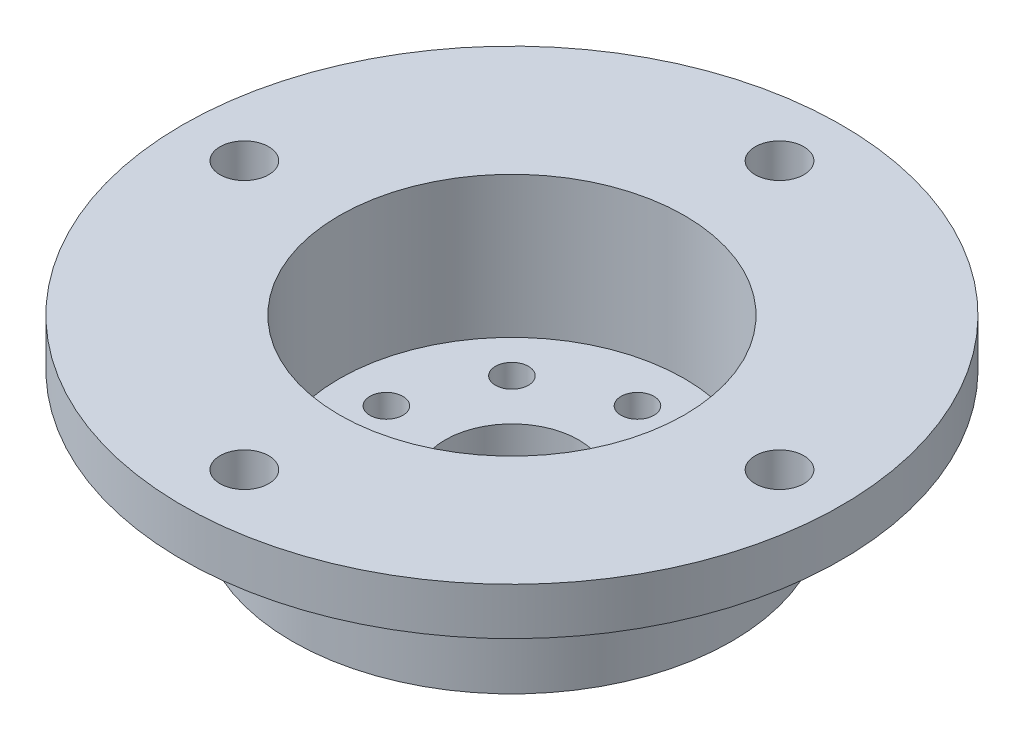
ISO-10303-21;
HEADER;
FILE_DESCRIPTION(('STEP AP214'),'2;1');
FILE_NAME('part.step','',(''),(''),'','','');
FILE_SCHEMA(('AUTOMOTIVE_DESIGN { 1 0 10303 214 1 1 1 1 }'));
ENDSEC;
DATA;
#1=APPLICATION_CONTEXT('core data for automotive mechanical design processes');
#2=APPLICATION_PROTOCOL_DEFINITION('international standard','automotive_design',2000,#1);
#3=PRODUCT_CONTEXT('',#1,'mechanical');
#4=PRODUCT('Part','Part','',(#3));
#5=PRODUCT_RELATED_PRODUCT_CATEGORY('part','',(#4));
#6=PRODUCT_DEFINITION_FORMATION('','',#4);
#7=PRODUCT_DEFINITION_CONTEXT('part definition',#1,'design');
#8=PRODUCT_DEFINITION('design','',#6,#7);
#9=PRODUCT_DEFINITION_SHAPE('','',#8);
#10=(LENGTH_UNIT() NAMED_UNIT(*) SI_UNIT(.MILLI.,.METRE.));
#11=(NAMED_UNIT(*) PLANE_ANGLE_UNIT() SI_UNIT($,.RADIAN.));
#12=(NAMED_UNIT(*) SI_UNIT($,.STERADIAN.) SOLID_ANGLE_UNIT());
#13=UNCERTAINTY_MEASURE_WITH_UNIT(LENGTH_MEASURE(1.E-05),#10,'distance_accuracy_value','');
#14=(GEOMETRIC_REPRESENTATION_CONTEXT(3) GLOBAL_UNCERTAINTY_ASSIGNED_CONTEXT((#13)) GLOBAL_UNIT_ASSIGNED_CONTEXT((#10,
#11,#12)) REPRESENTATION_CONTEXT('',''));
#15=CARTESIAN_POINT('',(0.,0.,0.));
#16=DIRECTION('',(0.,0.,1.));
#17=DIRECTION('',(1.,0.,0.));
#18=AXIS2_PLACEMENT_3D('',#15,#16,#17);
#19=CARTESIAN_POINT('',(-11.,23.3897955995638,0.));
#20=DIRECTION('',(0.,1.,0.));
#21=DIRECTION('',(-1.,0.,0.));
#22=AXIS2_PLACEMENT_3D('',#19,#20,#21);
#23=PLANE('',#22);
#24=CARTESIAN_POINT('',(0.,23.3897955995638,17.05));
#25=DIRECTION('',(0.,-1.,0.));
#26=DIRECTION('',(1.,0.,0.));
#27=AXIS2_PLACEMENT_3D('',#24,#25,#26);
#28=CIRCLE('',#27,1.55);
#29=CARTESIAN_POINT('',(1.55,23.3897955995638,17.05));
#30=VERTEX_POINT('',#29);
#31=EDGE_CURVE('E84',#30,#30,#28,.T.);
#32=ORIENTED_EDGE('',*,*,#31,.T.);
#33=EDGE_LOOP('',(#32));
#34=FACE_BOUND('',#33,.T.);
#35=CARTESIAN_POINT('',(17.05,23.3897955995638,0.));
#36=DIRECTION('',(0.,-1.,0.));
#37=DIRECTION('',(1.,0.,0.));
#38=AXIS2_PLACEMENT_3D('',#35,#36,#37);
#39=CIRCLE('',#38,1.55000000000058);
#40=CARTESIAN_POINT('',(18.6000000000006,23.3897955995638,0.));
#41=VERTEX_POINT('',#40);
#42=EDGE_CURVE('E163',#41,#41,#39,.T.);
#43=ORIENTED_EDGE('',*,*,#42,.T.);
#44=EDGE_LOOP('',(#43));
#45=FACE_BOUND('',#44,.T.);
#46=CARTESIAN_POINT('',(0.,23.3897955995638,-17.05));
#47=DIRECTION('',(0.,-1.,0.));
#48=DIRECTION('',(1.,0.,0.));
#49=AXIS2_PLACEMENT_3D('',#46,#47,#48);
#50=CIRCLE('',#49,1.55000000000089);
#51=CARTESIAN_POINT('',(1.55000000000089,23.3897955995638,-17.05));
#52=VERTEX_POINT('',#51);
#53=EDGE_CURVE('E155',#52,#52,#50,.T.);
#54=ORIENTED_EDGE('',*,*,#53,.T.);
#55=EDGE_LOOP('',(#54));
#56=FACE_BOUND('',#55,.T.);
#57=CARTESIAN_POINT('',(-17.05,23.3897955995638,0.));
#58=DIRECTION('',(0.,-1.,0.));
#59=DIRECTION('',(1.,0.,0.));
#60=AXIS2_PLACEMENT_3D('',#57,#58,#59);
#61=CIRCLE('',#60,1.55000000000031);
#62=CARTESIAN_POINT('',(-15.4999999999997,23.3897955995638,0.));
#63=VERTEX_POINT('',#62);
#64=EDGE_CURVE('E147',#63,#63,#61,.T.);
#65=ORIENTED_EDGE('',*,*,#64,.T.);
#66=EDGE_LOOP('',(#65));
#67=FACE_BOUND('',#66,.T.);
#68=CARTESIAN_POINT('',(0.,23.3897955995638,0.));
#69=DIRECTION('',(0.,1.,0.));
#70=DIRECTION('',(-1.,0.,0.));
#71=AXIS2_PLACEMENT_3D('',#68,#69,#70);
#72=CIRCLE('',#71,21.);
#73=CARTESIAN_POINT('',(-21.,23.3897955995638,0.));
#74=VERTEX_POINT('',#73);
#75=EDGE_CURVE('E10',#74,#74,#72,.T.);
#76=ORIENTED_EDGE('',*,*,#75,.T.);
#77=EDGE_LOOP('',(#76));
#78=FACE_BOUND('',#77,.T.);
#79=CARTESIAN_POINT('',(0.,23.3897955995638,0.));
#80=DIRECTION('',(0.,1.,0.));
#81=DIRECTION('',(-1.,0.,0.));
#82=AXIS2_PLACEMENT_3D('',#79,#80,#81);
#83=CIRCLE('',#82,11.);
#84=CARTESIAN_POINT('',(-11.,23.3897955995638,0.));
#85=VERTEX_POINT('',#84);
#86=EDGE_CURVE('E74',#85,#85,#83,.T.);
#87=ORIENTED_EDGE('',*,*,#86,.F.);
#88=EDGE_LOOP('',(#87));
#89=FACE_BOUND('',#88,.T.);
#90=ADVANCED_FACE('F39',(#34,#45,#56,#67,#78,#89),#23,.T.);
#91=CARTESIAN_POINT('',(0.,36.8297907398254,0.));
#92=DIRECTION('',(0.,1.,0.));
#93=DIRECTION('',(-1.,0.,0.));
#94=AXIS2_PLACEMENT_3D('',#91,#92,#93);
#95=CYLINDRICAL_SURFACE('',#94,21.);
#96=CARTESIAN_POINT('',(0.,20.3897955995638,0.));
#97=DIRECTION('',(0.,1.,0.));
#98=DIRECTION('',(-1.,0.,0.));
#99=AXIS2_PLACEMENT_3D('',#96,#97,#98);
#100=CIRCLE('',#99,21.);
#101=CARTESIAN_POINT('',(-21.,20.3897955995638,0.));
#102=VERTEX_POINT('',#101);
#103=EDGE_CURVE('E46',#102,#102,#100,.T.);
#104=ORIENTED_EDGE('',*,*,#103,.T.);
#105=EDGE_LOOP('',(#104));
#106=FACE_BOUND('',#105,.T.);
#107=ORIENTED_EDGE('',*,*,#75,.F.);
#108=EDGE_LOOP('',(#107));
#109=FACE_BOUND('',#108,.T.);
#110=ADVANCED_FACE('F188',(#106,#109),#95,.T.);
#111=CARTESIAN_POINT('',(-21.,20.3897955995638,0.));
#112=DIRECTION('',(0.,-1.,0.));
#113=DIRECTION('',(1.,0.,0.));
#114=AXIS2_PLACEMENT_3D('',#111,#112,#113);
#115=PLANE('',#114);
#116=CARTESIAN_POINT('',(0.,20.3897955995638,17.05));
#117=DIRECTION('',(0.,-1.,0.));
#118=DIRECTION('',(1.,0.,0.));
#119=AXIS2_PLACEMENT_3D('',#116,#117,#118);
#120=CIRCLE('',#119,1.55);
#121=CARTESIAN_POINT('',(1.55,20.3897955995638,17.05));
#122=VERTEX_POINT('',#121);
#123=EDGE_CURVE('E167',#122,#122,#120,.T.);
#124=ORIENTED_EDGE('',*,*,#123,.F.);
#125=EDGE_LOOP('',(#124));
#126=FACE_BOUND('',#125,.T.);
#127=CARTESIAN_POINT('',(17.05,20.3897955995638,0.));
#128=DIRECTION('',(0.,-1.,0.));
#129=DIRECTION('',(1.,0.,0.));
#130=AXIS2_PLACEMENT_3D('',#127,#128,#129);
#131=CIRCLE('',#130,1.55000000000058);
#132=CARTESIAN_POINT('',(18.6000000000006,20.3897955995638,0.));
#133=VERTEX_POINT('',#132);
#134=EDGE_CURVE('E159',#133,#133,#131,.T.);
#135=ORIENTED_EDGE('',*,*,#134,.F.);
#136=EDGE_LOOP('',(#135));
#137=FACE_BOUND('',#136,.T.);
#138=CARTESIAN_POINT('',(0.,20.3897955995638,-17.05));
#139=DIRECTION('',(0.,-1.,0.));
#140=DIRECTION('',(1.,0.,0.));
#141=AXIS2_PLACEMENT_3D('',#138,#139,#140);
#142=CIRCLE('',#141,1.55000000000089);
#143=CARTESIAN_POINT('',(1.55000000000089,20.3897955995638,-17.05));
#144=VERTEX_POINT('',#143);
#145=EDGE_CURVE('E151',#144,#144,#142,.T.);
#146=ORIENTED_EDGE('',*,*,#145,.F.);
#147=EDGE_LOOP('',(#146));
#148=FACE_BOUND('',#147,.T.);
#149=CARTESIAN_POINT('',(-17.05,20.3897955995638,0.));
#150=DIRECTION('',(0.,-1.,0.));
#151=DIRECTION('',(1.,0.,0.));
#152=AXIS2_PLACEMENT_3D('',#149,#150,#151);
#153=CIRCLE('',#152,1.55000000000031);
#154=CARTESIAN_POINT('',(-15.4999999999997,20.3897955995638,0.));
#155=VERTEX_POINT('',#154);
#156=EDGE_CURVE('E143',#155,#155,#153,.T.);
#157=ORIENTED_EDGE('',*,*,#156,.F.);
#158=EDGE_LOOP('',(#157));
#159=FACE_BOUND('',#158,.T.);
#160=CARTESIAN_POINT('',(0.,20.3897955995638,0.));
#161=DIRECTION('',(0.,1.,0.));
#162=DIRECTION('',(-1.,0.,0.));
#163=AXIS2_PLACEMENT_3D('',#160,#161,#162);
#164=CIRCLE('',#163,14.);
#165=CARTESIAN_POINT('',(-14.,20.3897955995638,0.));
#166=VERTEX_POINT('',#165);
#167=EDGE_CURVE('E51',#166,#166,#164,.T.);
#168=ORIENTED_EDGE('',*,*,#167,.T.);
#169=EDGE_LOOP('',(#168));
#170=FACE_BOUND('',#169,.T.);
#171=ORIENTED_EDGE('',*,*,#103,.F.);
#172=EDGE_LOOP('',(#171));
#173=FACE_BOUND('',#172,.T.);
#174=ADVANCED_FACE('F184',(#126,#137,#148,#159,#170,#173),#115,.T.);
#175=CARTESIAN_POINT('',(0.,36.8297907398254,0.));
#176=DIRECTION('',(0.,1.,0.));
#177=DIRECTION('',(-1.,0.,0.));
#178=AXIS2_PLACEMENT_3D('',#175,#176,#177);
#179=CYLINDRICAL_SURFACE('',#178,14.);
#180=CARTESIAN_POINT('',(0.,12.3897955995638,0.));
#181=DIRECTION('',(0.,1.,0.));
#182=DIRECTION('',(-1.,0.,0.));
#183=AXIS2_PLACEMENT_3D('',#180,#181,#182);
#184=CIRCLE('',#183,14.);
#185=CARTESIAN_POINT('',(-14.,12.3897955995638,0.));
#186=VERTEX_POINT('',#185);
#187=EDGE_CURVE('E56',#186,#186,#184,.T.);
#188=ORIENTED_EDGE('',*,*,#187,.T.);
#189=EDGE_LOOP('',(#188));
#190=FACE_BOUND('',#189,.T.);
#191=ORIENTED_EDGE('',*,*,#167,.F.);
#192=EDGE_LOOP('',(#191));
#193=FACE_BOUND('',#192,.T.);
#194=ADVANCED_FACE('F187',(#190,#193),#179,.T.);
#195=CARTESIAN_POINT('',(-14.,12.3897955995638,0.));
#196=DIRECTION('',(0.,-1.,0.));
#197=DIRECTION('',(1.,0.,0.));
#198=AXIS2_PLACEMENT_3D('',#195,#196,#197);
#199=PLANE('',#198);
#200=CARTESIAN_POINT('',(0.,12.3897955995638,-8.));
#201=DIRECTION('',(0.,1.,0.));
#202=DIRECTION('',(-1.,0.,0.));
#203=AXIS2_PLACEMENT_3D('',#200,#201,#202);
#204=CIRCLE('',#203,1.05);
#205=CARTESIAN_POINT('',(-1.05,12.3897955995638,-8.));
#206=VERTEX_POINT('',#205);
#207=EDGE_CURVE('E78',#206,#206,#204,.T.);
#208=ORIENTED_EDGE('',*,*,#207,.T.);
#209=EDGE_LOOP('',(#208));
#210=FACE_BOUND('',#209,.T.);
#211=CARTESIAN_POINT('',(5.65685424949248,12.3897955995638,-5.65685424949262));
#212=DIRECTION('',(0.,1.,0.));
#213=DIRECTION('',(-1.,0.,0.));
#214=AXIS2_PLACEMENT_3D('',#211,#212,#213);
#215=CIRCLE('',#214,1.05);
#216=CARTESIAN_POINT('',(4.60685424949248,12.3897955995638,-5.65685424949262));
#217=VERTEX_POINT('',#216);
#218=EDGE_CURVE('E132',#217,#217,#215,.T.);
#219=ORIENTED_EDGE('',*,*,#218,.T.);
#220=EDGE_LOOP('',(#219));
#221=FACE_BOUND('',#220,.T.);
#222=CARTESIAN_POINT('',(8.00000000000034,12.3897955995638,-3.39590937005871E-13));
#223=DIRECTION('',(0.,1.,0.));
#224=DIRECTION('',(-1.,0.,0.));
#225=AXIS2_PLACEMENT_3D('',#222,#223,#224);
#226=CIRCLE('',#225,1.05);
#227=CARTESIAN_POINT('',(6.95000000000034,12.3897955995638,-3.39590937005871E-13));
#228=VERTEX_POINT('',#227);
#229=EDGE_CURVE('E124',#228,#228,#226,.T.);
#230=ORIENTED_EDGE('',*,*,#229,.T.);
#231=EDGE_LOOP('',(#230));
#232=FACE_BOUND('',#231,.T.);
#233=CARTESIAN_POINT('',(5.65685424949296,12.3897955995638,5.65685424949214));
#234=DIRECTION('',(0.,1.,0.));
#235=DIRECTION('',(-1.,0.,0.));
#236=AXIS2_PLACEMENT_3D('',#233,#234,#235);
#237=CIRCLE('',#236,1.05);
#238=CARTESIAN_POINT('',(4.60685424949296,12.3897955995638,5.65685424949214));
#239=VERTEX_POINT('',#238);
#240=EDGE_CURVE('E116',#239,#239,#237,.T.);
#241=ORIENTED_EDGE('',*,*,#240,.T.);
#242=EDGE_LOOP('',(#241));
#243=FACE_BOUND('',#242,.T.);
#244=CARTESIAN_POINT('',(6.775171171787E-13,12.3897955995638,8.));
#245=DIRECTION('',(0.,1.,0.));
#246=DIRECTION('',(-1.,0.,0.));
#247=AXIS2_PLACEMENT_3D('',#244,#245,#246);
#248=CIRCLE('',#247,1.05);
#249=CARTESIAN_POINT('',(-1.04999999999932,12.3897955995638,8.));
#250=VERTEX_POINT('',#249);
#251=EDGE_CURVE('E108',#250,#250,#248,.T.);
#252=ORIENTED_EDGE('',*,*,#251,.T.);
#253=EDGE_LOOP('',(#252));
#254=FACE_BOUND('',#253,.T.);
#255=CARTESIAN_POINT('',(-5.6568542494918,12.3897955995638,5.65685424949262));
#256=DIRECTION('',(0.,1.,0.));
#257=DIRECTION('',(-1.,0.,0.));
#258=AXIS2_PLACEMENT_3D('',#255,#256,#257);
#259=CIRCLE('',#258,1.05);
#260=CARTESIAN_POINT('',(-6.7068542494918,12.3897955995638,5.65685424949262));
#261=VERTEX_POINT('',#260);
#262=EDGE_CURVE('E100',#261,#261,#259,.T.);
#263=ORIENTED_EDGE('',*,*,#262,.T.);
#264=EDGE_LOOP('',(#263));
#265=FACE_BOUND('',#264,.T.);
#266=CARTESIAN_POINT('',(-7.99999999999966,12.3897955995638,3.40570654445189E-13));
#267=DIRECTION('',(0.,1.,0.));
#268=DIRECTION('',(-1.,0.,0.));
#269=AXIS2_PLACEMENT_3D('',#266,#267,#268);
#270=CIRCLE('',#269,1.05);
#271=CARTESIAN_POINT('',(-9.04999999999966,12.3897955995638,3.40570654445189E-13));
#272=VERTEX_POINT('',#271);
#273=EDGE_CURVE('E92',#272,#272,#270,.T.);
#274=ORIENTED_EDGE('',*,*,#273,.T.);
#275=EDGE_LOOP('',(#274));
#276=FACE_BOUND('',#275,.T.);
#277=CARTESIAN_POINT('',(-5.65685424949228,12.3897955995638,-5.65685424949214));
#278=DIRECTION('',(0.,1.,0.));
#279=DIRECTION('',(-1.,0.,0.));
#280=AXIS2_PLACEMENT_3D('',#277,#278,#279);
#281=CIRCLE('',#280,1.05);
#282=CARTESIAN_POINT('',(-6.70685424949228,12.3897955995638,-5.65685424949214));
#283=VERTEX_POINT('',#282);
#284=EDGE_CURVE('E83',#283,#283,#281,.T.);
#285=ORIENTED_EDGE('',*,*,#284,.T.);
#286=EDGE_LOOP('',(#285));
#287=FACE_BOUND('',#286,.T.);
#288=CARTESIAN_POINT('',(0.,12.3897955995638,0.));
#289=DIRECTION('',(0.,1.,0.));
#290=DIRECTION('',(-1.,0.,0.));
#291=AXIS2_PLACEMENT_3D('',#288,#289,#290);
#292=CIRCLE('',#291,4.25);
#293=CARTESIAN_POINT('',(-4.25,12.3897955995638,0.));
#294=VERTEX_POINT('',#293);
#295=EDGE_CURVE('E62',#294,#294,#292,.T.);
#296=ORIENTED_EDGE('',*,*,#295,.T.);
#297=EDGE_LOOP('',(#296));
#298=FACE_BOUND('',#297,.T.);
#299=ORIENTED_EDGE('',*,*,#187,.F.);
#300=EDGE_LOOP('',(#299));
#301=FACE_BOUND('',#300,.T.);
#302=ADVANCED_FACE('F200',(#210,#221,#232,#243,#254,#265,#276,#287,#298,#301),#199,.T.);
#303=CARTESIAN_POINT('',(0.,36.8297907398254,0.));
#304=DIRECTION('',(0.,1.,0.));
#305=DIRECTION('',(-1.,0.,0.));
#306=AXIS2_PLACEMENT_3D('',#303,#304,#305);
#307=CYLINDRICAL_SURFACE('',#306,4.25);
#308=CARTESIAN_POINT('',(0.,14.3897955995638,0.));
#309=DIRECTION('',(0.,1.,0.));
#310=DIRECTION('',(-1.,0.,0.));
#311=AXIS2_PLACEMENT_3D('',#308,#309,#310);
#312=CIRCLE('',#311,4.25);
#313=CARTESIAN_POINT('',(-4.25,14.3897955995638,0.));
#314=VERTEX_POINT('',#313);
#315=EDGE_CURVE('E66',#314,#314,#312,.T.);
#316=ORIENTED_EDGE('',*,*,#315,.T.);
#317=EDGE_LOOP('',(#316));
#318=FACE_BOUND('',#317,.T.);
#319=ORIENTED_EDGE('',*,*,#295,.F.);
#320=EDGE_LOOP('',(#319));
#321=FACE_BOUND('',#320,.T.);
#322=ADVANCED_FACE('F206',(#318,#321),#307,.F.);
#323=CARTESIAN_POINT('',(-4.25,14.3897955995638,0.));
#324=DIRECTION('',(0.,1.,0.));
#325=DIRECTION('',(-1.,0.,0.));
#326=AXIS2_PLACEMENT_3D('',#323,#324,#325);
#327=PLANE('',#326);
#328=CARTESIAN_POINT('',(0.,14.3897955995638,-8.));
#329=DIRECTION('',(0.,1.,0.));
#330=DIRECTION('',(-1.,0.,0.));
#331=AXIS2_PLACEMENT_3D('',#328,#329,#330);
#332=CIRCLE('',#331,1.05);
#333=CARTESIAN_POINT('',(-1.05,14.3897955995638,-8.));
#334=VERTEX_POINT('',#333);
#335=EDGE_CURVE('E136',#334,#334,#332,.T.);
#336=ORIENTED_EDGE('',*,*,#335,.F.);
#337=EDGE_LOOP('',(#336));
#338=FACE_BOUND('',#337,.T.);
#339=CARTESIAN_POINT('',(5.65685424949248,14.3897955995638,-5.65685424949262));
#340=DIRECTION('',(0.,1.,0.));
#341=DIRECTION('',(-1.,0.,0.));
#342=AXIS2_PLACEMENT_3D('',#339,#340,#341);
#343=CIRCLE('',#342,1.05);
#344=CARTESIAN_POINT('',(4.60685424949248,14.3897955995638,-5.65685424949262));
#345=VERTEX_POINT('',#344);
#346=EDGE_CURVE('E128',#345,#345,#343,.T.);
#347=ORIENTED_EDGE('',*,*,#346,.F.);
#348=EDGE_LOOP('',(#347));
#349=FACE_BOUND('',#348,.T.);
#350=CARTESIAN_POINT('',(8.00000000000034,14.3897955995638,-3.39590937005871E-13));
#351=DIRECTION('',(0.,1.,0.));
#352=DIRECTION('',(-1.,0.,0.));
#353=AXIS2_PLACEMENT_3D('',#350,#351,#352);
#354=CIRCLE('',#353,1.05);
#355=CARTESIAN_POINT('',(6.95000000000034,14.3897955995638,-3.39590937005871E-13));
#356=VERTEX_POINT('',#355);
#357=EDGE_CURVE('E120',#356,#356,#354,.T.);
#358=ORIENTED_EDGE('',*,*,#357,.F.);
#359=EDGE_LOOP('',(#358));
#360=FACE_BOUND('',#359,.T.);
#361=CARTESIAN_POINT('',(5.65685424949296,14.3897955995638,5.65685424949214));
#362=DIRECTION('',(0.,1.,0.));
#363=DIRECTION('',(-1.,0.,0.));
#364=AXIS2_PLACEMENT_3D('',#361,#362,#363);
#365=CIRCLE('',#364,1.05);
#366=CARTESIAN_POINT('',(4.60685424949296,14.3897955995638,5.65685424949214));
#367=VERTEX_POINT('',#366);
#368=EDGE_CURVE('E112',#367,#367,#365,.T.);
#369=ORIENTED_EDGE('',*,*,#368,.F.);
#370=EDGE_LOOP('',(#369));
#371=FACE_BOUND('',#370,.T.);
#372=CARTESIAN_POINT('',(6.7724838686436E-13,14.3897955995638,8.));
#373=DIRECTION('',(0.,1.,0.));
#374=DIRECTION('',(-1.,0.,0.));
#375=AXIS2_PLACEMENT_3D('',#372,#373,#374);
#376=CIRCLE('',#375,1.05);
#377=CARTESIAN_POINT('',(-1.04999999999932,14.3897955995638,8.));
#378=VERTEX_POINT('',#377);
#379=EDGE_CURVE('E104',#378,#378,#376,.T.);
#380=ORIENTED_EDGE('',*,*,#379,.F.);
#381=EDGE_LOOP('',(#380));
#382=FACE_BOUND('',#381,.T.);
#383=CARTESIAN_POINT('',(-5.6568542494918,14.3897955995638,5.65685424949262));
#384=DIRECTION('',(0.,1.,0.));
#385=DIRECTION('',(-1.,0.,0.));
#386=AXIS2_PLACEMENT_3D('',#383,#384,#385);
#387=CIRCLE('',#386,1.05);
#388=CARTESIAN_POINT('',(-6.7068542494918,14.3897955995638,5.65685424949262));
#389=VERTEX_POINT('',#388);
#390=EDGE_CURVE('E96',#389,#389,#387,.T.);
#391=ORIENTED_EDGE('',*,*,#390,.F.);
#392=EDGE_LOOP('',(#391));
#393=FACE_BOUND('',#392,.T.);
#394=CARTESIAN_POINT('',(-7.99999999999966,14.3897955995638,3.40570654445189E-13));
#395=DIRECTION('',(0.,1.,0.));
#396=DIRECTION('',(-1.,0.,0.));
#397=AXIS2_PLACEMENT_3D('',#394,#395,#396);
#398=CIRCLE('',#397,1.05);
#399=CARTESIAN_POINT('',(-9.04999999999966,14.3897955995638,3.40570654445189E-13));
#400=VERTEX_POINT('',#399);
#401=EDGE_CURVE('E88',#400,#400,#398,.T.);
#402=ORIENTED_EDGE('',*,*,#401,.F.);
#403=EDGE_LOOP('',(#402));
#404=FACE_BOUND('',#403,.T.);
#405=CARTESIAN_POINT('',(-5.65685424949228,14.3897955995638,-5.65685424949214));
#406=DIRECTION('',(0.,1.,0.));
#407=DIRECTION('',(-1.,0.,0.));
#408=AXIS2_PLACEMENT_3D('',#405,#406,#407);
#409=CIRCLE('',#408,1.05);
#410=CARTESIAN_POINT('',(-6.70685424949228,14.3897955995638,-5.65685424949214));
#411=VERTEX_POINT('',#410);
#412=EDGE_CURVE('E79',#411,#411,#409,.T.);
#413=ORIENTED_EDGE('',*,*,#412,.F.);
#414=EDGE_LOOP('',(#413));
#415=FACE_BOUND('',#414,.T.);
#416=CARTESIAN_POINT('',(0.,14.3897955995638,0.));
#417=DIRECTION('',(0.,1.,0.));
#418=DIRECTION('',(-1.,0.,0.));
#419=AXIS2_PLACEMENT_3D('',#416,#417,#418);
#420=CIRCLE('',#419,11.);
#421=CARTESIAN_POINT('',(-11.,14.3897955995638,0.));
#422=VERTEX_POINT('',#421);
#423=EDGE_CURVE('E70',#422,#422,#420,.T.);
#424=ORIENTED_EDGE('',*,*,#423,.T.);
#425=EDGE_LOOP('',(#424));
#426=FACE_BOUND('',#425,.T.);
#427=ORIENTED_EDGE('',*,*,#315,.F.);
#428=EDGE_LOOP('',(#427));
#429=FACE_BOUND('',#428,.T.);
#430=ADVANCED_FACE('F302',(#338,#349,#360,#371,#382,#393,#404,#415,#426,#429),#327,.T.);
#431=CARTESIAN_POINT('',(0.,36.8297907398254,0.));
#432=DIRECTION('',(0.,1.,0.));
#433=DIRECTION('',(-1.,0.,0.));
#434=AXIS2_PLACEMENT_3D('',#431,#432,#433);
#435=CYLINDRICAL_SURFACE('',#434,11.);
#436=ORIENTED_EDGE('',*,*,#86,.T.);
#437=EDGE_LOOP('',(#436));
#438=FACE_BOUND('',#437,.T.);
#439=ORIENTED_EDGE('',*,*,#423,.F.);
#440=EDGE_LOOP('',(#439));
#441=FACE_BOUND('',#440,.T.);
#442=ADVANCED_FACE('F298',(#438,#441),#435,.F.);
#443=CARTESIAN_POINT('',(-5.65685424949228,12.3897955995638,-5.65685424949214));
#444=DIRECTION('',(0.,1.,0.));
#445=DIRECTION('',(-1.,0.,0.));
#446=AXIS2_PLACEMENT_3D('',#443,#444,#445);
#447=CYLINDRICAL_SURFACE('',#446,1.05);
#448=ORIENTED_EDGE('',*,*,#284,.F.);
#449=EDGE_LOOP('',(#448));
#450=FACE_BOUND('',#449,.T.);
#451=ORIENTED_EDGE('',*,*,#412,.T.);
#452=EDGE_LOOP('',(#451));
#453=FACE_BOUND('',#452,.T.);
#454=ADVANCED_FACE('F294',(#450,#453),#447,.F.);
#455=CARTESIAN_POINT('',(-7.99999999999966,12.3897955995638,3.40570654445189E-13));
#456=DIRECTION('',(0.,1.,0.));
#457=DIRECTION('',(-1.,0.,0.));
#458=AXIS2_PLACEMENT_3D('',#455,#456,#457);
#459=CYLINDRICAL_SURFACE('',#458,1.05);
#460=ORIENTED_EDGE('',*,*,#273,.F.);
#461=EDGE_LOOP('',(#460));
#462=FACE_BOUND('',#461,.T.);
#463=ORIENTED_EDGE('',*,*,#401,.T.);
#464=EDGE_LOOP('',(#463));
#465=FACE_BOUND('',#464,.T.);
#466=ADVANCED_FACE('F290',(#462,#465),#459,.F.);
#467=CARTESIAN_POINT('',(-5.6568542494918,12.3897955995638,5.65685424949262));
#468=DIRECTION('',(0.,1.,0.));
#469=DIRECTION('',(-1.,0.,0.));
#470=AXIS2_PLACEMENT_3D('',#467,#468,#469);
#471=CYLINDRICAL_SURFACE('',#470,1.05);
#472=ORIENTED_EDGE('',*,*,#262,.F.);
#473=EDGE_LOOP('',(#472));
#474=FACE_BOUND('',#473,.T.);
#475=ORIENTED_EDGE('',*,*,#390,.T.);
#476=EDGE_LOOP('',(#475));
#477=FACE_BOUND('',#476,.T.);
#478=ADVANCED_FACE('F286',(#474,#477),#471,.F.);
#479=CARTESIAN_POINT('',(6.775171171787E-13,12.3897955995638,8.));
#480=DIRECTION('',(0.,1.,0.));
#481=DIRECTION('',(-1.,0.,0.));
#482=AXIS2_PLACEMENT_3D('',#479,#480,#481);
#483=CYLINDRICAL_SURFACE('',#482,1.05);
#484=ORIENTED_EDGE('',*,*,#251,.F.);
#485=EDGE_LOOP('',(#484));
#486=FACE_BOUND('',#485,.T.);
#487=ORIENTED_EDGE('',*,*,#379,.T.);
#488=EDGE_LOOP('',(#487));
#489=FACE_BOUND('',#488,.T.);
#490=ADVANCED_FACE('F282',(#486,#489),#483,.F.);
#491=CARTESIAN_POINT('',(5.65685424949296,12.3897955995638,5.65685424949214));
#492=DIRECTION('',(0.,1.,0.));
#493=DIRECTION('',(-1.,0.,0.));
#494=AXIS2_PLACEMENT_3D('',#491,#492,#493);
#495=CYLINDRICAL_SURFACE('',#494,1.05);
#496=ORIENTED_EDGE('',*,*,#240,.F.);
#497=EDGE_LOOP('',(#496));
#498=FACE_BOUND('',#497,.T.);
#499=ORIENTED_EDGE('',*,*,#368,.T.);
#500=EDGE_LOOP('',(#499));
#501=FACE_BOUND('',#500,.T.);
#502=ADVANCED_FACE('F278',(#498,#501),#495,.F.);
#503=CARTESIAN_POINT('',(8.00000000000034,12.3897955995638,-3.39590937005871E-13));
#504=DIRECTION('',(0.,1.,0.));
#505=DIRECTION('',(-1.,0.,0.));
#506=AXIS2_PLACEMENT_3D('',#503,#504,#505);
#507=CYLINDRICAL_SURFACE('',#506,1.05);
#508=ORIENTED_EDGE('',*,*,#229,.F.);
#509=EDGE_LOOP('',(#508));
#510=FACE_BOUND('',#509,.T.);
#511=ORIENTED_EDGE('',*,*,#357,.T.);
#512=EDGE_LOOP('',(#511));
#513=FACE_BOUND('',#512,.T.);
#514=ADVANCED_FACE('F274',(#510,#513),#507,.F.);
#515=CARTESIAN_POINT('',(5.65685424949248,12.3897955995638,-5.65685424949262));
#516=DIRECTION('',(0.,1.,0.));
#517=DIRECTION('',(-1.,0.,0.));
#518=AXIS2_PLACEMENT_3D('',#515,#516,#517);
#519=CYLINDRICAL_SURFACE('',#518,1.05);
#520=ORIENTED_EDGE('',*,*,#218,.F.);
#521=EDGE_LOOP('',(#520));
#522=FACE_BOUND('',#521,.T.);
#523=ORIENTED_EDGE('',*,*,#346,.T.);
#524=EDGE_LOOP('',(#523));
#525=FACE_BOUND('',#524,.T.);
#526=ADVANCED_FACE('F270',(#522,#525),#519,.F.);
#527=CARTESIAN_POINT('',(0.,12.3897955995638,-8.));
#528=DIRECTION('',(0.,1.,0.));
#529=DIRECTION('',(-1.,0.,0.));
#530=AXIS2_PLACEMENT_3D('',#527,#528,#529);
#531=CYLINDRICAL_SURFACE('',#530,1.05);
#532=ORIENTED_EDGE('',*,*,#207,.F.);
#533=EDGE_LOOP('',(#532));
#534=FACE_BOUND('',#533,.T.);
#535=ORIENTED_EDGE('',*,*,#335,.T.);
#536=EDGE_LOOP('',(#535));
#537=FACE_BOUND('',#536,.T.);
#538=ADVANCED_FACE('F235',(#534,#537),#531,.F.);
#539=CARTESIAN_POINT('',(-17.05,23.3897955995638,0.));
#540=DIRECTION('',(0.,-1.,0.));
#541=DIRECTION('',(1.,0.,0.));
#542=AXIS2_PLACEMENT_3D('',#539,#540,#541);
#543=CYLINDRICAL_SURFACE('',#542,1.55000000000031);
#544=ORIENTED_EDGE('',*,*,#64,.F.);
#545=EDGE_LOOP('',(#544));
#546=FACE_BOUND('',#545,.T.);
#547=ORIENTED_EDGE('',*,*,#156,.T.);
#548=EDGE_LOOP('',(#547));
#549=FACE_BOUND('',#548,.T.);
#550=ADVANCED_FACE('F229',(#546,#549),#543,.F.);
#551=CARTESIAN_POINT('',(0.,23.3897955995638,-17.05));
#552=DIRECTION('',(0.,-1.,0.));
#553=DIRECTION('',(1.,0.,0.));
#554=AXIS2_PLACEMENT_3D('',#551,#552,#553);
#555=CYLINDRICAL_SURFACE('',#554,1.55000000000089);
#556=ORIENTED_EDGE('',*,*,#53,.F.);
#557=EDGE_LOOP('',(#556));
#558=FACE_BOUND('',#557,.T.);
#559=ORIENTED_EDGE('',*,*,#145,.T.);
#560=EDGE_LOOP('',(#559));
#561=FACE_BOUND('',#560,.T.);
#562=ADVANCED_FACE('F234',(#558,#561),#555,.F.);
#563=CARTESIAN_POINT('',(17.05,23.3897955995638,0.));
#564=DIRECTION('',(0.,-1.,0.));
#565=DIRECTION('',(1.,0.,0.));
#566=AXIS2_PLACEMENT_3D('',#563,#564,#565);
#567=CYLINDRICAL_SURFACE('',#566,1.55000000000058);
#568=ORIENTED_EDGE('',*,*,#42,.F.);
#569=EDGE_LOOP('',(#568));
#570=FACE_BOUND('',#569,.T.);
#571=ORIENTED_EDGE('',*,*,#134,.T.);
#572=EDGE_LOOP('',(#571));
#573=FACE_BOUND('',#572,.T.);
#574=ADVANCED_FACE('F180',(#570,#573),#567,.F.);
#575=CARTESIAN_POINT('',(0.,23.3897955995638,17.05));
#576=DIRECTION('',(0.,-1.,0.));
#577=DIRECTION('',(1.,0.,0.));
#578=AXIS2_PLACEMENT_3D('',#575,#576,#577);
#579=CYLINDRICAL_SURFACE('',#578,1.55);
#580=ORIENTED_EDGE('',*,*,#31,.F.);
#581=EDGE_LOOP('',(#580));
#582=FACE_BOUND('',#581,.T.);
#583=ORIENTED_EDGE('',*,*,#123,.T.);
#584=EDGE_LOOP('',(#583));
#585=FACE_BOUND('',#584,.T.);
#586=ADVANCED_FACE('F177',(#582,#585),#579,.F.);
#587=CLOSED_SHELL('',(#90,#110,#174,#194,#302,#322,#430,#442,#454,#466,#478,#490,#502,#514,#526,
#538,#550,#562,#574,#586));
#588=MANIFOLD_SOLID_BREP('B2',#587);
#589=ADVANCED_BREP_SHAPE_REPRESENTATION('',(#18,#588),#14);
#590=SHAPE_DEFINITION_REPRESENTATION(#9,#589);
ENDSEC;
END-ISO-10303-21;
